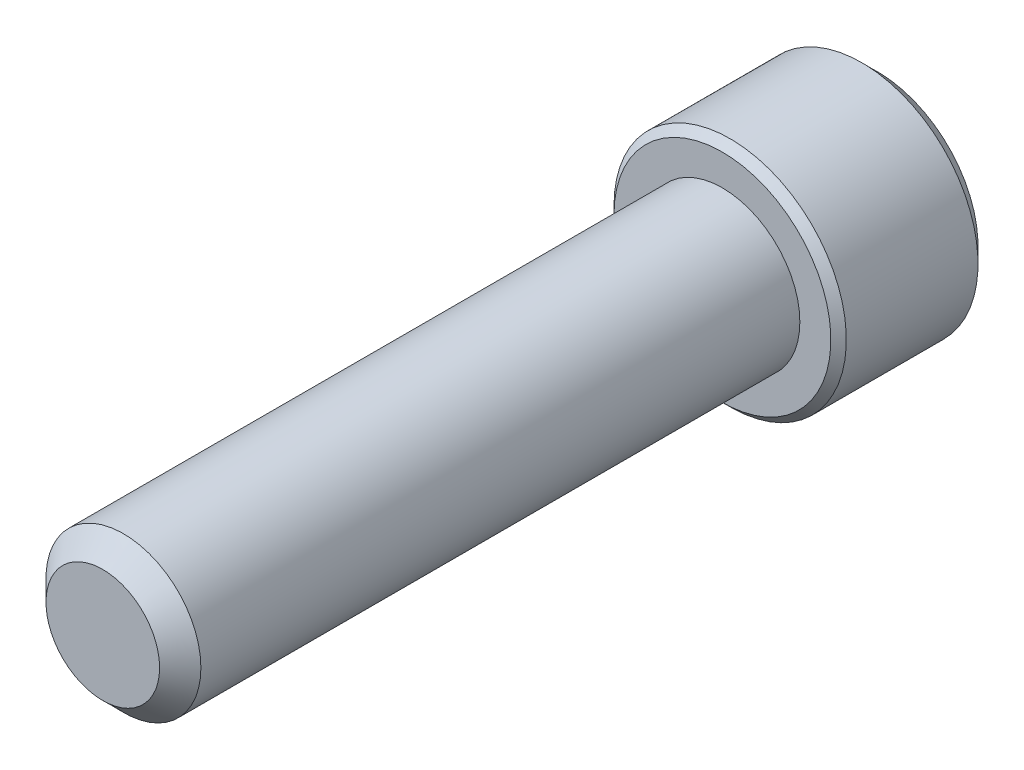
ISO-10303-21;
HEADER;
FILE_DESCRIPTION(('STEP AP214'),'2;1');
FILE_NAME('part.step','',(''),(''),'','','');
FILE_SCHEMA(('AUTOMOTIVE_DESIGN { 1 0 10303 214 1 1 1 1 }'));
ENDSEC;
DATA;
#1=APPLICATION_CONTEXT('core data for automotive mechanical design processes');
#2=APPLICATION_PROTOCOL_DEFINITION('international standard','automotive_design',2000,#1);
#3=PRODUCT_CONTEXT('',#1,'mechanical');
#4=PRODUCT('Part','Part','',(#3));
#5=PRODUCT_RELATED_PRODUCT_CATEGORY('part','',(#4));
#6=PRODUCT_DEFINITION_FORMATION('','',#4);
#7=PRODUCT_DEFINITION_CONTEXT('part definition',#1,'design');
#8=PRODUCT_DEFINITION('design','',#6,#7);
#9=PRODUCT_DEFINITION_SHAPE('','',#8);
#10=(LENGTH_UNIT() NAMED_UNIT(*) SI_UNIT(.MILLI.,.METRE.));
#11=(NAMED_UNIT(*) PLANE_ANGLE_UNIT() SI_UNIT($,.RADIAN.));
#12=(NAMED_UNIT(*) SI_UNIT($,.STERADIAN.) SOLID_ANGLE_UNIT());
#13=UNCERTAINTY_MEASURE_WITH_UNIT(LENGTH_MEASURE(1.E-05),#10,'distance_accuracy_value','');
#14=(GEOMETRIC_REPRESENTATION_CONTEXT(3) GLOBAL_UNCERTAINTY_ASSIGNED_CONTEXT((#13)) GLOBAL_UNIT_ASSIGNED_CONTEXT((#10,
#11,#12)) REPRESENTATION_CONTEXT('',''));
#15=CARTESIAN_POINT('',(0.,0.,0.));
#16=DIRECTION('',(0.,0.,1.));
#17=DIRECTION('',(1.,0.,0.));
#18=AXIS2_PLACEMENT_3D('',#15,#16,#17);
#19=CARTESIAN_POINT('',(0.,0.,-31.75));
#20=DIRECTION('',(0.,0.,1.));
#21=DIRECTION('',(1.,0.,0.));
#22=AXIS2_PLACEMENT_3D('',#19,#20,#21);
#23=CYLINDRICAL_SURFACE('',#22,3.96875);
#24=CARTESIAN_POINT('',(0.,0.,-1.05833333333333));
#25=DIRECTION('',(0.,0.,1.));
#26=DIRECTION('',(1.,0.,0.));
#27=AXIS2_PLACEMENT_3D('',#24,#25,#26);
#28=CIRCLE('',#27,3.96875);
#29=CARTESIAN_POINT('',(3.96875,0.,-1.05833333333333));
#30=VERTEX_POINT('',#29);
#31=EDGE_CURVE('E11',#30,#30,#28,.F.);
#32=ORIENTED_EDGE('',*,*,#31,.T.);
#33=EDGE_LOOP('',(#32));
#34=FACE_BOUND('',#33,.T.);
#35=CARTESIAN_POINT('',(0.,0.,-31.75));
#36=DIRECTION('',(0.,0.,-1.));
#37=DIRECTION('',(-1.,0.,0.));
#38=AXIS2_PLACEMENT_3D('',#35,#36,#37);
#39=CIRCLE('',#38,3.96875);
#40=CARTESIAN_POINT('',(-3.96875,0.,-31.75));
#41=VERTEX_POINT('',#40);
#42=EDGE_CURVE('E106',#41,#41,#39,.F.);
#43=ORIENTED_EDGE('',*,*,#42,.T.);
#44=EDGE_LOOP('',(#43));
#45=FACE_BOUND('',#44,.T.);
#46=ADVANCED_FACE('F32',(#34,#45),#23,.T.);
#47=CARTESIAN_POINT('',(0.,0.,0.));
#48=DIRECTION('',(0.,0.,1.));
#49=DIRECTION('',(1.,0.,0.));
#50=AXIS2_PLACEMENT_3D('',#47,#48,#49);
#51=PLANE('',#50);
#52=CARTESIAN_POINT('',(0.,0.,0.));
#53=DIRECTION('',(0.,0.,1.));
#54=DIRECTION('',(1.,0.,0.));
#55=AXIS2_PLACEMENT_3D('',#52,#53,#54);
#56=CIRCLE('',#55,2.91041666666667);
#57=CARTESIAN_POINT('',(2.91041666666667,0.,0.));
#58=VERTEX_POINT('',#57);
#59=EDGE_CURVE('E40',#58,#58,#56,.T.);
#60=ORIENTED_EDGE('',*,*,#59,.T.);
#61=EDGE_LOOP('',(#60));
#62=FACE_BOUND('',#61,.T.);
#63=ADVANCED_FACE('F176',(#62),#51,.T.);
#64=CARTESIAN_POINT('',(0.,0.,-39.6875));
#65=DIRECTION('',(0.,0.,1.));
#66=DIRECTION('',(1.,0.,0.));
#67=AXIS2_PLACEMENT_3D('',#64,#65,#66);
#68=CYLINDRICAL_SURFACE('',#67,5.953125);
#69=CARTESIAN_POINT('',(0.,0.,-32.146875));
#70=DIRECTION('',(0.,0.,-1.));
#71=DIRECTION('',(-1.,0.,0.));
#72=AXIS2_PLACEMENT_3D('',#69,#70,#71);
#73=CIRCLE('',#72,5.953125);
#74=CARTESIAN_POINT('',(-5.953125,0.,-32.146875));
#75=VERTEX_POINT('',#74);
#76=EDGE_CURVE('E168',#75,#75,#73,.T.);
#77=ORIENTED_EDGE('',*,*,#76,.T.);
#78=EDGE_LOOP('',(#77));
#79=FACE_BOUND('',#78,.T.);
#80=CARTESIAN_POINT('',(0.,0.,-38.89375));
#81=DIRECTION('',(0.,0.,-1.));
#82=DIRECTION('',(-1.,0.,0.));
#83=AXIS2_PLACEMENT_3D('',#80,#81,#82);
#84=CIRCLE('',#83,5.953125);
#85=CARTESIAN_POINT('',(-5.953125,0.,-38.89375));
#86=VERTEX_POINT('',#85);
#87=EDGE_CURVE('E165',#86,#86,#84,.F.);
#88=ORIENTED_EDGE('',*,*,#87,.T.);
#89=EDGE_LOOP('',(#88));
#90=FACE_BOUND('',#89,.T.);
#91=ADVANCED_FACE('F193',(#79,#90),#68,.T.);
#92=CARTESIAN_POINT('',(0.,0.,-39.6875));
#93=DIRECTION('',(0.,0.,-1.));
#94=DIRECTION('',(-1.,0.,0.));
#95=AXIS2_PLACEMENT_3D('',#92,#93,#94);
#96=PLANE('',#95);
#97=CARTESIAN_POINT('',(0.,0.,-39.6875));
#98=DIRECTION('',(0.,0.,-1.));
#99=DIRECTION('',(-1.,0.,0.));
#100=AXIS2_PLACEMENT_3D('',#97,#98,#99);
#101=CIRCLE('',#100,5.159375);
#102=CARTESIAN_POINT('',(-5.159375,0.,-39.6875));
#103=VERTEX_POINT('',#102);
#104=EDGE_CURVE('E105',#103,#103,#101,.T.);
#105=ORIENTED_EDGE('',*,*,#104,.T.);
#106=EDGE_LOOP('',(#105));
#107=FACE_BOUND('',#106,.T.);
#108=CARTESIAN_POINT('',(0.,0.,-39.6875));
#109=DIRECTION('',(0.,0.,-1.));
#110=DIRECTION('',(-1.,0.,0.));
#111=AXIS2_PLACEMENT_3D('',#108,#109,#110);
#112=CIRCLE('',#111,3.66617420935412);
#113=CARTESIAN_POINT('',(-3.175,1.83308710467706,-39.6875));
#114=VERTEX_POINT('',#113);
#115=CARTESIAN_POINT('',(0.,3.66617420935412,-39.6875));
#116=VERTEX_POINT('',#115);
#117=EDGE_CURVE('E86',#114,#116,#112,.T.);
#118=ORIENTED_EDGE('',*,*,#117,.F.);
#119=CARTESIAN_POINT('',(-3.175,-1.83308710467706,-39.6875));
#120=VERTEX_POINT('',#119);
#121=EDGE_CURVE('E46',#120,#114,#112,.T.);
#122=ORIENTED_EDGE('',*,*,#121,.F.);
#123=CARTESIAN_POINT('',(0.,-3.66617420935412,-39.6875));
#124=VERTEX_POINT('',#123);
#125=EDGE_CURVE('E400',#124,#120,#112,.T.);
#126=ORIENTED_EDGE('',*,*,#125,.F.);
#127=CARTESIAN_POINT('',(3.175,-1.83308710467706,-39.6875));
#128=VERTEX_POINT('',#127);
#129=EDGE_CURVE('E53',#128,#124,#112,.T.);
#130=ORIENTED_EDGE('',*,*,#129,.F.);
#131=CARTESIAN_POINT('',(3.175,1.83308710467706,-39.6875));
#132=VERTEX_POINT('',#131);
#133=EDGE_CURVE('E127',#132,#128,#112,.T.);
#134=ORIENTED_EDGE('',*,*,#133,.F.);
#135=EDGE_CURVE('E95',#116,#132,#112,.T.);
#136=ORIENTED_EDGE('',*,*,#135,.F.);
#137=EDGE_LOOP('',(#118,#122,#126,#130,#134,#136));
#138=FACE_BOUND('',#137,.T.);
#139=ADVANCED_FACE('F126',(#107,#138),#96,.T.);
#140=CARTESIAN_POINT('',(0.,0.,-31.75));
#141=DIRECTION('',(0.,0.,-1.));
#142=DIRECTION('',(-1.,0.,0.));
#143=AXIS2_PLACEMENT_3D('',#140,#141,#142);
#144=PLANE('',#143);
#145=CARTESIAN_POINT('',(0.,0.,-31.75));
#146=DIRECTION('',(0.,0.,-1.));
#147=DIRECTION('',(-1.,0.,0.));
#148=AXIS2_PLACEMENT_3D('',#145,#146,#147);
#149=CIRCLE('',#148,5.55625);
#150=CARTESIAN_POINT('',(-5.55625,0.,-31.75));
#151=VERTEX_POINT('',#150);
#152=EDGE_CURVE('E171',#151,#151,#149,.F.);
#153=ORIENTED_EDGE('',*,*,#152,.T.);
#154=EDGE_LOOP('',(#153));
#155=FACE_BOUND('',#154,.T.);
#156=ORIENTED_EDGE('',*,*,#42,.F.);
#157=EDGE_LOOP('',(#156));
#158=FACE_BOUND('',#157,.T.);
#159=ADVANCED_FACE('F209',(#155,#158),#144,.F.);
#160=CARTESIAN_POINT('',(0.,0.,-39.6875));
#161=DIRECTION('',(0.,0.,-1.));
#162=DIRECTION('',(-1.,0.,0.));
#163=AXIS2_PLACEMENT_3D('',#160,#161,#162);
#164=CONICAL_SURFACE('',#163,3.66617420935412,0.78539816339745);
#165=ORIENTED_EDGE('',*,*,#135,.T.);
#166=CARTESIAN_POINT('',(-0.00020000000000059,3.66628967940796,-39.6876154755089));
#167=CARTESIAN_POINT('',(0.108938349949826,3.60327862368552,-39.6246589836918));
#168=CARTESIAN_POINT('',(0.219901628077945,3.53921394518808,-39.5654001042347));
#169=CARTESIAN_POINT('',(0.446167846345947,3.40857908316254,-39.4568986557306));
#170=CARTESIAN_POINT('',(0.561492303252263,3.34199647692353,-39.4077164539387));
#171=CARTESIAN_POINT('',(0.794038522480626,3.207735854653,-39.323466458874));
#172=CARTESIAN_POINT('',(0.911201066281151,3.14009202845083,-39.2881869144994));
#173=CARTESIAN_POINT('',(1.14810544464628,3.00331522182952,-39.2338315701348));
#174=CARTESIAN_POINT('',(1.26784004264355,2.93418641944448,-39.2147151975296));
#175=CARTESIAN_POINT('',(1.47419791875158,2.81504564412411,-39.1974671306232));
#176=CARTESIAN_POINT('',(1.56055470772916,2.76518752876156,-39.1949139336138));
#177=CARTESIAN_POINT('',(1.73312781652472,2.66555239794355,-39.1992162731233));
#178=CARTESIAN_POINT('',(1.8193440764928,2.61577541704245,-39.2060751080214));
#179=CARTESIAN_POINT('',(1.99095979158713,2.51669303773557,-39.2288098833037));
#180=CARTESIAN_POINT('',(2.07635822425327,2.4673882296474,-39.2446959096873));
#181=CARTESIAN_POINT('',(2.24568840330547,2.36962540518969,-39.284617983998));
#182=CARTESIAN_POINT('',(2.32962026161975,2.32116732419836,-39.3086534070852));
#183=CARTESIAN_POINT('',(2.47862357928412,2.23514021863468,-39.3581052344172));
#184=CARTESIAN_POINT('',(2.54402485119173,2.19738077669348,-39.382221719301));
#185=CARTESIAN_POINT('',(2.67365325020511,2.12253978562849,-39.4343414671372));
#186=CARTESIAN_POINT('',(2.73788034144173,2.08545825721376,-39.4623448486035));
#187=CARTESIAN_POINT('',(2.8649580345126,2.01208991691129,-39.5216105655445));
#188=CARTESIAN_POINT('',(2.92781225074873,1.97580101824766,-39.5528626533542));
#189=CARTESIAN_POINT('',(3.0523566208481,1.90389529264474,-39.6182153443919));
#190=CARTESIAN_POINT('',(3.11404746097871,1.86827806948879,-39.6523141995185));
#191=CARTESIAN_POINT('',(3.1752,1.83297163462322,-39.6876154755089));
#192=B_SPLINE_CURVE_WITH_KNOTS('',3,(#166,#167,#168,#169,#170,#171,#172,#173,#174,#175,#176,
#177,#178,#179,#180,#181,#182,#183,#184,#185,#186,#187,#188,#189,#190,#191),.UNSPECIFIED.,.F.,
.F.,(4,2,2,2,2,2,2,2,2,2,2,2,4),(0.,0.422910572436809,0.84828505542781,1.26690402276128,
1.68446903107506,1.98329272958352,2.2822211754689,2.58148426995466,2.88072442418452,
3.11844134429546,3.35616551414405,3.59316134346767,3.8300126974443),.UNSPECIFIED.);
#193=EDGE_CURVE('E100',#116,#132,#192,.T.);
#194=ORIENTED_EDGE('',*,*,#193,.F.);
#195=EDGE_LOOP('',(#165,#194));
#196=FACE_BOUND('',#195,.T.);
#197=ADVANCED_FACE('F101',(#196),#164,.F.);
#198=ORIENTED_EDGE('',*,*,#133,.T.);
#199=CARTESIAN_POINT('',(3.175,-3.70444383584785,-40.9002118451619));
#200=CARTESIAN_POINT('',(3.175,-3.61446006856654,-40.8319043948676));
#201=CARTESIAN_POINT('',(3.175,-3.52397795214463,-40.7642428612445));
#202=CARTESIAN_POINT('',(3.175,-3.34181836123848,-40.6305025492024));
#203=CARTESIAN_POINT('',(3.175,-3.250140597284,-40.5644241654826));
#204=CARTESIAN_POINT('',(3.175,-3.06472035593928,-40.4336709408018));
#205=CARTESIAN_POINT('',(3.175,-2.97096738900307,-40.3690109250879));
#206=CARTESIAN_POINT('',(3.175,-2.78187869931256,-40.2420558022517));
#207=CARTESIAN_POINT('',(3.175,-2.68654308817008,-40.179760529372));
#208=CARTESIAN_POINT('',(3.175,-2.48836016870252,-40.0544784446062));
#209=CARTESIAN_POINT('',(3.175,-2.38540128536647,-39.9916672392123));
#210=CARTESIAN_POINT('',(3.175,-2.17707529026741,-39.8701078544743));
#211=CARTESIAN_POINT('',(3.175,-2.07170779370641,-39.811360330462));
#212=CARTESIAN_POINT('',(3.175,-1.85856318748113,-39.6991912176541));
#213=CARTESIAN_POINT('',(3.175,-1.75079438294671,-39.6457539709328));
#214=CARTESIAN_POINT('',(3.175,-1.53228582600746,-39.5454020450525));
#215=CARTESIAN_POINT('',(3.175,-1.42154746336339,-39.4984843761431));
#216=CARTESIAN_POINT('',(3.175,-1.20656057350991,-39.416530034464));
#217=CARTESIAN_POINT('',(3.175,-1.10257181507285,-39.3808189415949));
#218=CARTESIAN_POINT('',(3.175,-0.892048260878869,-39.3177329725217));
#219=CARTESIAN_POINT('',(3.175,-0.785513294311063,-39.2903586572879));
#220=CARTESIAN_POINT('',(3.175,-0.572329012717394,-39.2458460023287));
#221=CARTESIAN_POINT('',(3.175,-0.465717564636556,-39.2285292889146));
#222=CARTESIAN_POINT('',(3.175,-0.251301383583122,-39.2044756602937));
#223=CARTESIAN_POINT('',(3.175,-0.143496870917772,-39.1977368235873));
#224=CARTESIAN_POINT('',(3.175,0.068106995182755,-39.1953609564692));
#225=CARTESIAN_POINT('',(3.175,0.171901813638644,-39.1993091223896));
#226=CARTESIAN_POINT('',(3.175,0.378625872879028,-39.2171624071181));
#227=CARTESIAN_POINT('',(3.175,0.48155503009556,-39.2310684763143));
#228=CARTESIAN_POINT('',(3.175,0.687543944903109,-39.2683074222191));
#229=CARTESIAN_POINT('',(3.175,0.790573911747975,-39.2918024293294));
#230=CARTESIAN_POINT('',(3.175,0.994382635323689,-39.3469517792586));
#231=CARTESIAN_POINT('',(3.175,1.09516156281328,-39.3786055008759));
#232=CARTESIAN_POINT('',(3.175,1.30251417649916,-39.4516294931737));
#233=CARTESIAN_POINT('',(3.175,1.40887912364162,-39.4935863005657));
#234=CARTESIAN_POINT('',(3.175,1.61884111284847,-39.5839490627203));
#235=CARTESIAN_POINT('',(3.175,1.72243722600422,-39.6323571499939));
#236=CARTESIAN_POINT('',(3.175,1.92738358083041,-39.7344798355874));
#237=CARTESIAN_POINT('',(3.175,2.02872533588119,-39.788211328075));
#238=CARTESIAN_POINT('',(3.175,2.22907994672305,-39.8997921629552));
#239=CARTESIAN_POINT('',(3.175,2.32809316592036,-39.9576408570403));
#240=CARTESIAN_POINT('',(3.175,2.51923503723041,-40.0736949409625));
#241=CARTESIAN_POINT('',(3.175,2.61146147877823,-40.1317401210939));
#242=CARTESIAN_POINT('',(3.175,2.79433061473592,-40.250281230002));
#243=CARTESIAN_POINT('',(3.175,2.88497318880335,-40.310777343852));
#244=CARTESIAN_POINT('',(3.175,3.06414875022216,-40.4332851399095));
#245=CARTESIAN_POINT('',(3.175,3.15269287411231,-40.4952805926272));
#246=CARTESIAN_POINT('',(3.175,3.32856950185137,-40.6209183631728));
#247=CARTESIAN_POINT('',(3.175,3.41590233249717,-40.6845602229942));
#248=CARTESIAN_POINT('',(3.175,3.50272764399218,-40.7488754675913));
#249=B_SPLINE_CURVE_WITH_KNOTS('',3,(#199,#200,#201,#202,#203,#204,#205,#206,#207,#208,#209,
#210,#211,#212,#213,#214,#215,#216,#217,#218,#219,#220,#221,#222,#223,#224,#225,#226,#227,#228,
#229,#230,#231,#232,#233,#234,#235,#236,#237,#238,#239,#240,#241,#242,#243,#244,#245,#246,#247,
#248),.UNSPECIFIED.,.F.,.F.,(4,2,2,2,2,2,2,2,2,2,2,2,2,2,2,2,2,2,2,2,2,2,2,2,4),(0.,
0.338926722917917,0.677937083279515,1.01957183491539,1.36118259515686,1.72292567400708,
2.08472695420016,2.44542763005297,2.8059623458982,3.13552343983682,3.46510670458908,
3.78865064563719,4.11213580725537,4.42324708341662,4.73438805617943,5.05102342839298,
5.36763469922674,5.71039210015347,6.05326308403164,6.39725934486602,6.74120155829904,
7.06807292474688,7.39496901986435,7.71921932182542,8.0433803719942),.UNSPECIFIED.);
#250=EDGE_CURVE('E94',#132,#128,#249,.F.);
#251=ORIENTED_EDGE('',*,*,#250,.F.);
#252=EDGE_LOOP('',(#198,#251));
#253=FACE_BOUND('',#252,.T.);
#254=ADVANCED_FACE('F275',(#253),#164,.F.);
#255=ORIENTED_EDGE('',*,*,#129,.T.);
#256=CARTESIAN_POINT('',(3.1752,-1.83297163462322,-39.6876154755089));
#257=CARTESIAN_POINT('',(3.06606165005017,-1.89598269034567,-39.6246589836918));
#258=CARTESIAN_POINT('',(2.95509837192205,-1.9600473688431,-39.5654001042347));
#259=CARTESIAN_POINT('',(2.72883215365405,-2.09068223086865,-39.4568986557306));
#260=CARTESIAN_POINT('',(2.61350769674774,-2.15726483710766,-39.4077164539387));
#261=CARTESIAN_POINT('',(2.38096147751937,-2.29152545937819,-39.323466458874));
#262=CARTESIAN_POINT('',(2.26379893371885,-2.35916928558036,-39.2881869144995));
#263=CARTESIAN_POINT('',(2.02689455535372,-2.49594609220167,-39.2338315701348));
#264=CARTESIAN_POINT('',(1.90715995735645,-2.56507489458671,-39.2147151975296));
#265=CARTESIAN_POINT('',(1.70080208124842,-2.68421566990707,-39.1974671306232));
#266=CARTESIAN_POINT('',(1.61444529227084,-2.73407378526963,-39.1949139336138));
#267=CARTESIAN_POINT('',(1.44187218347528,-2.83370891608764,-39.1992162731233));
#268=CARTESIAN_POINT('',(1.3556559235072,-2.88348589698873,-39.2060751080214));
#269=CARTESIAN_POINT('',(1.18404020841287,-2.98256827629561,-39.2288098833037));
#270=CARTESIAN_POINT('',(1.09864177574673,-3.03187308438378,-39.2446959096873));
#271=CARTESIAN_POINT('',(0.929311596694525,-3.1296359088415,-39.284617983998));
#272=CARTESIAN_POINT('',(0.845379738380251,-3.17809398983283,-39.3086534070852));
#273=CARTESIAN_POINT('',(0.696376420715883,-3.2641210953965,-39.3581052344172));
#274=CARTESIAN_POINT('',(0.630975148808266,-3.30188053733771,-39.382221719301));
#275=CARTESIAN_POINT('',(0.50134674979489,-3.3767215284027,-39.4343414671372));
#276=CARTESIAN_POINT('',(0.437119658558273,-3.41380305681743,-39.4623448486035));
#277=CARTESIAN_POINT('',(0.310041965487397,-3.4871713971199,-39.5216105655445));
#278=CARTESIAN_POINT('',(0.247187749251273,-3.52346029578352,-39.5528626533542));
#279=CARTESIAN_POINT('',(0.122643379151905,-3.59536602138645,-39.6182153443919));
#280=CARTESIAN_POINT('',(0.0609525390212888,-3.63098324454239,-39.6523141995185));
#281=CARTESIAN_POINT('',(-0.000200000000002001,-3.66628967940796,-39.6876154755089));
#282=B_SPLINE_CURVE_WITH_KNOTS('',3,(#256,#257,#258,#259,#260,#261,#262,#263,#264,#265,#266,
#267,#268,#269,#270,#271,#272,#273,#274,#275,#276,#277,#278,#279,#280,#281),.UNSPECIFIED.,.F.,
.F.,(4,2,2,2,2,2,2,2,2,2,2,2,4),(0.,0.422910572436809,0.84828505542781,1.26690402276127,
1.68446903107506,1.98329272958352,2.2822211754689,2.58148426995466,2.88072442418452,
3.11844134429546,3.35616551414405,3.59316134346767,3.8300126974443),.UNSPECIFIED.);
#283=EDGE_CURVE('E136',#128,#124,#282,.T.);
#284=ORIENTED_EDGE('',*,*,#283,.F.);
#285=EDGE_LOOP('',(#255,#284));
#286=FACE_BOUND('',#285,.T.);
#287=ADVANCED_FACE('F267',(#286),#164,.F.);
#288=ORIENTED_EDGE('',*,*,#125,.T.);
#289=CARTESIAN_POINT('',(0.000200000000001088,-3.66628967940796,-39.6876154755089));
#290=CARTESIAN_POINT('',(-0.108938349949826,-3.60327862368552,-39.6246589836918));
#291=CARTESIAN_POINT('',(-0.219901628077945,-3.53921394518809,-39.5654001042347));
#292=CARTESIAN_POINT('',(-0.446167846345946,-3.40857908316254,-39.4568986557306));
#293=CARTESIAN_POINT('',(-0.561492303252263,-3.34199647692353,-39.4077164539387));
#294=CARTESIAN_POINT('',(-0.794038522480626,-3.207735854653,-39.323466458874));
#295=CARTESIAN_POINT('',(-0.911201066281151,-3.14009202845083,-39.2881869144994));
#296=CARTESIAN_POINT('',(-1.14810544464628,-3.00331522182952,-39.2338315701348));
#297=CARTESIAN_POINT('',(-1.26784004264355,-2.93418641944448,-39.2147151975296));
#298=CARTESIAN_POINT('',(-1.47419791875158,-2.81504564412411,-39.1974671306232));
#299=CARTESIAN_POINT('',(-1.56055470772915,-2.76518752876156,-39.1949139336138));
#300=CARTESIAN_POINT('',(-1.73312781652472,-2.66555239794355,-39.1992162731233));
#301=CARTESIAN_POINT('',(-1.8193440764928,-2.61577541704245,-39.2060751080214));
#302=CARTESIAN_POINT('',(-1.99095979158713,-2.51669303773557,-39.2288098833037));
#303=CARTESIAN_POINT('',(-2.07635822425327,-2.4673882296474,-39.2446959096873));
#304=CARTESIAN_POINT('',(-2.24568840330547,-2.36962540518969,-39.284617983998));
#305=CARTESIAN_POINT('',(-2.32962026161975,-2.32116732419836,-39.3086534070852));
#306=CARTESIAN_POINT('',(-2.47862357928412,-2.23514021863469,-39.3581052344172));
#307=CARTESIAN_POINT('',(-2.54402485119173,-2.19738077669348,-39.382221719301));
#308=CARTESIAN_POINT('',(-2.67365325020511,-2.12253978562849,-39.4343414671372));
#309=CARTESIAN_POINT('',(-2.73788034144173,-2.08545825721376,-39.4623448486035));
#310=CARTESIAN_POINT('',(-2.8649580345126,-2.01208991691129,-39.5216105655445));
#311=CARTESIAN_POINT('',(-2.92781225074873,-1.97580101824766,-39.5528626533542));
#312=CARTESIAN_POINT('',(-3.0523566208481,-1.90389529264474,-39.6182153443919));
#313=CARTESIAN_POINT('',(-3.11404746097871,-1.86827806948879,-39.6523141995185));
#314=CARTESIAN_POINT('',(-3.1752,-1.83297163462322,-39.6876154755089));
#315=B_SPLINE_CURVE_WITH_KNOTS('',3,(#289,#290,#291,#292,#293,#294,#295,#296,#297,#298,#299,
#300,#301,#302,#303,#304,#305,#306,#307,#308,#309,#310,#311,#312,#313,#314),.UNSPECIFIED.,.F.,
.F.,(4,2,2,2,2,2,2,2,2,2,2,2,4),(0.,0.422910572436809,0.848285055427809,1.26690402276128,
1.68446903107506,1.98329272958352,2.2822211754689,2.58148426995466,2.88072442418452,
3.11844134429546,3.35616551414405,3.59316134346767,3.8300126974443),.UNSPECIFIED.);
#316=EDGE_CURVE('E363',#124,#120,#315,.T.);
#317=ORIENTED_EDGE('',*,*,#316,.F.);
#318=EDGE_LOOP('',(#288,#317));
#319=FACE_BOUND('',#318,.T.);
#320=ADVANCED_FACE('F260',(#319),#164,.F.);
#321=ORIENTED_EDGE('',*,*,#121,.T.);
#322=CARTESIAN_POINT('',(-3.175,-3.70444383603083,-40.9002118453009));
#323=CARTESIAN_POINT('',(-3.175,-3.61446006874434,-40.8319043950011));
#324=CARTESIAN_POINT('',(-3.175,-3.52397795231723,-40.7642428613727));
#325=CARTESIAN_POINT('',(-3.175,-3.34181836140064,-40.63050254932));
#326=CARTESIAN_POINT('',(-3.175,-3.25014059744092,-40.5644241655949));
#327=CARTESIAN_POINT('',(-3.175,-3.06472035608553,-40.4336709409034));
#328=CARTESIAN_POINT('',(-3.175,-2.9709673891439,-40.3690109251841));
#329=CARTESIAN_POINT('',(-3.175,-2.78187869944244,-40.2420558023373));
#330=CARTESIAN_POINT('',(-3.175,-2.68654308829444,-40.1797605294523));
#331=CARTESIAN_POINT('',(-3.175,-2.48836016881498,-40.0544784446755));
#332=CARTESIAN_POINT('',(-3.175,-2.38540128547252,-39.991667239276));
#333=CARTESIAN_POINT('',(-3.175,-2.17707529036043,-39.8701078545269));
#334=CARTESIAN_POINT('',(-3.175,-2.0717077937928,-39.8113603305091));
#335=CARTESIAN_POINT('',(-3.175,-1.85856318755401,-39.6991912176908));
#336=CARTESIAN_POINT('',(-3.175,-1.75079438301272,-39.6457539709646));
#337=CARTESIAN_POINT('',(-3.175,-1.53228582605937,-39.5454020450749));
#338=CARTESIAN_POINT('',(-3.175,-1.42154746340806,-39.4984843761612));
#339=CARTESIAN_POINT('',(-3.175,-1.20656057355148,-39.416530034479));
#340=CARTESIAN_POINT('',(-3.175,-1.10257181511889,-39.3808189416102));
#341=CARTESIAN_POINT('',(-3.175,-0.892048260933982,-39.3177329725367));
#342=CARTESIAN_POINT('',(-3.175,-0.785513294370794,-39.2903586573024));
#343=CARTESIAN_POINT('',(-3.175,-0.572329012786208,-39.2458460023411));
#344=CARTESIAN_POINT('',(-3.175,-0.465717564709834,-39.2285292889253));
#345=CARTESIAN_POINT('',(-3.175,-0.251301383665186,-39.2044756603003));
#346=CARTESIAN_POINT('',(-3.175,-0.14349687100416,-39.1977368235913));
#347=CARTESIAN_POINT('',(-3.175,0.0681069950885746,-39.1953609564673));
#348=CARTESIAN_POINT('',(-3.175,0.171901813540983,-39.1993091223845));
#349=CARTESIAN_POINT('',(-3.175,0.378625872774766,-39.2171624071059));
#350=CARTESIAN_POINT('',(-3.175,0.481555029988177,-39.2310684762983));
#351=CARTESIAN_POINT('',(-3.175,0.687543944789565,-39.2683074221952));
#352=CARTESIAN_POINT('',(-3.175,0.790573911631401,-39.2918024293013));
#353=CARTESIAN_POINT('',(-3.175,0.994382635201356,-39.346951779222));
#354=CARTESIAN_POINT('',(-3.175,1.09516156268822,-39.3786055008352));
#355=CARTESIAN_POINT('',(-3.175,1.30251417635927,-39.4516294931208));
#356=CARTESIAN_POINT('',(-3.175,1.40887912348989,-39.4935863005044));
#357=CARTESIAN_POINT('',(-3.175,1.61884111267367,-39.5839490626411));
#358=CARTESIAN_POINT('',(-3.175,1.72243722581818,-39.6323571499053));
#359=CARTESIAN_POINT('',(-3.175,1.92738358062232,-39.7344798354796));
#360=CARTESIAN_POINT('',(-3.175,2.02872533566228,-39.7882113279573));
#361=CARTESIAN_POINT('',(-3.175,2.22907994648283,-39.8997921628173));
#362=CARTESIAN_POINT('',(-3.175,2.32809316566967,-39.9576408568921));
#363=CARTESIAN_POINT('',(-3.175,2.51923503696069,-40.0736949407949));
#364=CARTESIAN_POINT('',(-3.175,2.61146147849992,-40.1317401209172));
#365=CARTESIAN_POINT('',(-3.175,2.79433061444055,-40.2502812298069));
#366=CARTESIAN_POINT('',(-3.175,2.88497318849951,-40.3107773436477));
#367=CARTESIAN_POINT('',(-3.175,3.06414874990159,-40.4332851396869));
#368=CARTESIAN_POINT('',(-3.175,3.15269287378347,-40.4952805923955));
#369=CARTESIAN_POINT('',(-3.175,3.32856950150606,-40.6209183629229));
#370=CARTESIAN_POINT('',(-3.175,3.41590233214365,-40.6845602227352));
#371=CARTESIAN_POINT('',(-3.175,3.50272764363046,-40.7488754673233));
#372=B_SPLINE_CURVE_WITH_KNOTS('',3,(#322,#323,#324,#325,#326,#327,#328,#329,#330,#331,#332,
#333,#334,#335,#336,#337,#338,#339,#340,#341,#342,#343,#344,#345,#346,#347,#348,#349,#350,#351,
#352,#353,#354,#355,#356,#357,#358,#359,#360,#361,#362,#363,#364,#365,#366,#367,#368,#369,#370,
#371),.UNSPECIFIED.,.F.,.F.,(4,2,2,2,2,2,2,2,2,2,2,2,2,2,2,2,2,2,2,2,2,2,2,2,4),(0.,
0.338926722940014,0.677937083323707,1.0195718349821,1.36118259524609,1.72292567412157,
2.08472695433995,2.44542763021783,2.8059623460881,3.13552344001376,3.46510670475308,
3.7886506457888,4.1121358073946,4.42324708354509,4.73438805629712,5.05102342849904,
5.36763469932117,5.71039210020556,6.05326308404133,6.39725934483308,6.74120155822348,
7.06807292463488,7.3949690197159,7.71921932164102,8.04338037177384),.UNSPECIFIED.);
#373=EDGE_CURVE('E116',#120,#114,#372,.T.);
#374=ORIENTED_EDGE('',*,*,#373,.F.);
#375=EDGE_LOOP('',(#321,#374));
#376=FACE_BOUND('',#375,.T.);
#377=ADVANCED_FACE('F252',(#376),#164,.F.);
#378=ORIENTED_EDGE('',*,*,#117,.T.);
#379=CARTESIAN_POINT('',(-3.1752,1.83297163462322,-39.6876154755089));
#380=CARTESIAN_POINT('',(-3.06606165005017,1.89598269034567,-39.6246589836918));
#381=CARTESIAN_POINT('',(-2.95509837192205,1.9600473688431,-39.5654001042347));
#382=CARTESIAN_POINT('',(-2.72883215365405,2.09068223086865,-39.4568986557306));
#383=CARTESIAN_POINT('',(-2.61350769674774,2.15726483710766,-39.4077164539387));
#384=CARTESIAN_POINT('',(-2.38096147751937,2.29152545937818,-39.323466458874));
#385=CARTESIAN_POINT('',(-2.26379893371885,2.35916928558036,-39.2881869144994));
#386=CARTESIAN_POINT('',(-2.02689455535372,2.49594609220167,-39.2338315701348));
#387=CARTESIAN_POINT('',(-1.90715995735644,2.5650748945867,-39.2147151975296));
#388=CARTESIAN_POINT('',(-1.70080208124842,2.68421566990707,-39.1974671306232));
#389=CARTESIAN_POINT('',(-1.61444529227084,2.73407378526963,-39.1949139336138));
#390=CARTESIAN_POINT('',(-1.44187218347528,2.83370891608764,-39.1992162731233));
#391=CARTESIAN_POINT('',(-1.35565592350719,2.88348589698873,-39.2060751080214));
#392=CARTESIAN_POINT('',(-1.18404020841287,2.98256827629561,-39.2288098833037));
#393=CARTESIAN_POINT('',(-1.09864177574672,3.03187308438378,-39.2446959096873));
#394=CARTESIAN_POINT('',(-0.929311596694523,3.1296359088415,-39.284617983998));
#395=CARTESIAN_POINT('',(-0.845379738380249,3.17809398983283,-39.3086534070852));
#396=CARTESIAN_POINT('',(-0.696376420715881,3.2641210953965,-39.3581052344172));
#397=CARTESIAN_POINT('',(-0.630975148808264,3.30188053733771,-39.382221719301));
#398=CARTESIAN_POINT('',(-0.501346749794889,3.3767215284027,-39.4343414671372));
#399=CARTESIAN_POINT('',(-0.437119658558272,3.41380305681743,-39.4623448486035));
#400=CARTESIAN_POINT('',(-0.310041965487396,3.48717139711989,-39.5216105655445));
#401=CARTESIAN_POINT('',(-0.247187749251273,3.52346029578352,-39.5528626533542));
#402=CARTESIAN_POINT('',(-0.122643379151905,3.59536602138644,-39.6182153443919));
#403=CARTESIAN_POINT('',(-0.0609525390212894,3.63098324454239,-39.6523141995185));
#404=CARTESIAN_POINT('',(0.000200000000000794,3.66628967940796,-39.6876154755089));
#405=B_SPLINE_CURVE_WITH_KNOTS('',3,(#379,#380,#381,#382,#383,#384,#385,#386,#387,#388,#389,
#390,#391,#392,#393,#394,#395,#396,#397,#398,#399,#400,#401,#402,#403,#404),.UNSPECIFIED.,.F.,
.F.,(4,2,2,2,2,2,2,2,2,2,2,2,4),(0.,0.422910572436809,0.84828505542781,1.26690402276128,
1.68446903107507,1.98329272958352,2.28222117546891,2.58148426995466,2.88072442418452,
3.11844134429547,3.35616551414405,3.59316134346767,3.8300126974443),.UNSPECIFIED.);
#406=EDGE_CURVE('E90',#114,#116,#405,.T.);
#407=ORIENTED_EDGE('',*,*,#406,.F.);
#408=EDGE_LOOP('',(#378,#407));
#409=FACE_BOUND('',#408,.T.);
#410=ADVANCED_FACE('F88',(#409),#164,.F.);
#411=CARTESIAN_POINT('',(3.175,5.49926131403118,-34.925));
#412=DIRECTION('',(0.,0.,-1.));
#413=DIRECTION('',(-1.,0.,0.));
#414=AXIS2_PLACEMENT_3D('',#411,#412,#413);
#415=PLANE('',#414);
#416=DIRECTION('',(0.866025403784439,0.5,0.));
#417=VECTOR('',#416,1.);
#418=CARTESIAN_POINT('',(-3.175,1.83308710467706,-34.925));
#419=LINE('',#418,#417);
#420=CARTESIAN_POINT('',(-3.175,1.83308710467706,-34.925));
#421=VERTEX_POINT('',#420);
#422=CARTESIAN_POINT('',(0.,3.66617420935412,-34.925));
#423=VERTEX_POINT('',#422);
#424=EDGE_CURVE('E115',#421,#423,#419,.T.);
#425=ORIENTED_EDGE('',*,*,#424,.T.);
#426=DIRECTION('',(0.866025403784439,-0.5,0.));
#427=VECTOR('',#426,1.);
#428=CARTESIAN_POINT('',(0.,3.66617420935412,-34.925));
#429=LINE('',#428,#427);
#430=CARTESIAN_POINT('',(3.175,1.83308710467706,-34.925));
#431=VERTEX_POINT('',#430);
#432=EDGE_CURVE('E120',#423,#431,#429,.T.);
#433=ORIENTED_EDGE('',*,*,#432,.T.);
#434=DIRECTION('',(0.,-1.,0.));
#435=VECTOR('',#434,1.);
#436=CARTESIAN_POINT('',(3.175,1.83308710467706,-34.925));
#437=LINE('',#436,#435);
#438=CARTESIAN_POINT('',(3.175,-1.83308710467706,-34.925));
#439=VERTEX_POINT('',#438);
#440=EDGE_CURVE('E373',#431,#439,#437,.T.);
#441=ORIENTED_EDGE('',*,*,#440,.T.);
#442=DIRECTION('',(-0.866025403784439,-0.5,0.));
#443=VECTOR('',#442,1.);
#444=CARTESIAN_POINT('',(3.175,-1.83308710467706,-34.925));
#445=LINE('',#444,#443);
#446=CARTESIAN_POINT('',(0.,-3.66617420935412,-34.925));
#447=VERTEX_POINT('',#446);
#448=EDGE_CURVE('E376',#439,#447,#445,.T.);
#449=ORIENTED_EDGE('',*,*,#448,.T.);
#450=DIRECTION('',(-0.866025403784439,0.5,0.));
#451=VECTOR('',#450,1.);
#452=CARTESIAN_POINT('',(0.,-3.66617420935412,-34.925));
#453=LINE('',#452,#451);
#454=CARTESIAN_POINT('',(-3.175,-1.83308710467706,-34.925));
#455=VERTEX_POINT('',#454);
#456=EDGE_CURVE('E379',#447,#455,#453,.T.);
#457=ORIENTED_EDGE('',*,*,#456,.T.);
#458=DIRECTION('',(0.,1.,0.));
#459=VECTOR('',#458,1.);
#460=CARTESIAN_POINT('',(-3.175,-1.83308710467706,-34.925));
#461=LINE('',#460,#459);
#462=EDGE_CURVE('E123',#455,#421,#461,.T.);
#463=ORIENTED_EDGE('',*,*,#462,.T.);
#464=EDGE_LOOP('',(#425,#433,#441,#449,#457,#463));
#465=FACE_BOUND('',#464,.T.);
#466=ADVANCED_FACE('F155',(#465),#415,.T.);
#467=CARTESIAN_POINT('',(0.,3.66617420935412,-34.925));
#468=DIRECTION('',(0.5,0.866025403784439,0.));
#469=DIRECTION('',(-0.866025403784439,0.5,0.));
#470=AXIS2_PLACEMENT_3D('',#467,#468,#469);
#471=PLANE('',#470);
#472=DIRECTION('',(0.,0.,-1.));
#473=VECTOR('',#472,1.);
#474=CARTESIAN_POINT('',(0.,3.66617420935412,-34.925));
#475=LINE('',#474,#473);
#476=EDGE_CURVE('E112',#423,#116,#475,.T.);
#477=ORIENTED_EDGE('',*,*,#476,.T.);
#478=ORIENTED_EDGE('',*,*,#193,.T.);
#479=DIRECTION('',(0.,0.,-1.));
#480=VECTOR('',#479,1.);
#481=CARTESIAN_POINT('',(3.175,1.83308710467706,-34.925));
#482=LINE('',#481,#480);
#483=EDGE_CURVE('E122',#431,#132,#482,.T.);
#484=ORIENTED_EDGE('',*,*,#483,.F.);
#485=ORIENTED_EDGE('',*,*,#432,.F.);
#486=EDGE_LOOP('',(#477,#478,#484,#485));
#487=FACE_BOUND('',#486,.T.);
#488=ADVANCED_FACE('F118',(#487),#471,.F.);
#489=CARTESIAN_POINT('',(3.175,1.83308710467706,-34.925));
#490=DIRECTION('',(1.,0.,0.));
#491=DIRECTION('',(0.,1.,0.));
#492=AXIS2_PLACEMENT_3D('',#489,#490,#491);
#493=PLANE('',#492);
#494=ORIENTED_EDGE('',*,*,#483,.T.);
#495=ORIENTED_EDGE('',*,*,#250,.T.);
#496=DIRECTION('',(0.,0.,-1.));
#497=VECTOR('',#496,1.);
#498=CARTESIAN_POINT('',(3.175,-1.83308710467706,-34.925));
#499=LINE('',#498,#497);
#500=EDGE_CURVE('E390',#439,#128,#499,.T.);
#501=ORIENTED_EDGE('',*,*,#500,.F.);
#502=ORIENTED_EDGE('',*,*,#440,.F.);
#503=EDGE_LOOP('',(#494,#495,#501,#502));
#504=FACE_BOUND('',#503,.T.);
#505=ADVANCED_FACE('F144',(#504),#493,.F.);
#506=CARTESIAN_POINT('',(3.175,-1.83308710467706,-34.925));
#507=DIRECTION('',(0.5,-0.866025403784439,0.));
#508=DIRECTION('',(0.866025403784439,0.5,0.));
#509=AXIS2_PLACEMENT_3D('',#506,#507,#508);
#510=PLANE('',#509);
#511=ORIENTED_EDGE('',*,*,#500,.T.);
#512=ORIENTED_EDGE('',*,*,#283,.T.);
#513=DIRECTION('',(0.,0.,-1.));
#514=VECTOR('',#513,1.);
#515=CARTESIAN_POINT('',(0.,-3.66617420935412,-34.925));
#516=LINE('',#515,#514);
#517=EDGE_CURVE('E387',#447,#124,#516,.T.);
#518=ORIENTED_EDGE('',*,*,#517,.F.);
#519=ORIENTED_EDGE('',*,*,#448,.F.);
#520=EDGE_LOOP('',(#511,#512,#518,#519));
#521=FACE_BOUND('',#520,.T.);
#522=ADVANCED_FACE('F148',(#521),#510,.F.);
#523=CARTESIAN_POINT('',(0.,-3.66617420935412,-34.925));
#524=DIRECTION('',(-0.5,-0.866025403784439,0.));
#525=DIRECTION('',(0.866025403784439,-0.5,0.));
#526=AXIS2_PLACEMENT_3D('',#523,#524,#525);
#527=PLANE('',#526);
#528=ORIENTED_EDGE('',*,*,#517,.T.);
#529=ORIENTED_EDGE('',*,*,#316,.T.);
#530=DIRECTION('',(0.,0.,-1.));
#531=VECTOR('',#530,1.);
#532=CARTESIAN_POINT('',(-3.175,-1.83308710467706,-34.925));
#533=LINE('',#532,#531);
#534=EDGE_CURVE('E385',#455,#120,#533,.T.);
#535=ORIENTED_EDGE('',*,*,#534,.F.);
#536=ORIENTED_EDGE('',*,*,#456,.F.);
#537=EDGE_LOOP('',(#528,#529,#535,#536));
#538=FACE_BOUND('',#537,.T.);
#539=ADVANCED_FACE('F311',(#538),#527,.F.);
#540=CARTESIAN_POINT('',(-3.175,-1.83308710467706,-34.925));
#541=DIRECTION('',(-1.,0.,0.));
#542=DIRECTION('',(0.,-1.,0.));
#543=AXIS2_PLACEMENT_3D('',#540,#541,#542);
#544=PLANE('',#543);
#545=ORIENTED_EDGE('',*,*,#534,.T.);
#546=ORIENTED_EDGE('',*,*,#373,.T.);
#547=DIRECTION('',(0.,0.,-1.));
#548=VECTOR('',#547,1.);
#549=CARTESIAN_POINT('',(-3.175,1.83308710467706,-34.925));
#550=LINE('',#549,#548);
#551=EDGE_CURVE('E114',#421,#114,#550,.T.);
#552=ORIENTED_EDGE('',*,*,#551,.F.);
#553=ORIENTED_EDGE('',*,*,#462,.F.);
#554=EDGE_LOOP('',(#545,#546,#552,#553));
#555=FACE_BOUND('',#554,.T.);
#556=ADVANCED_FACE('F203',(#555),#544,.F.);
#557=CARTESIAN_POINT('',(-3.175,1.83308710467706,-34.925));
#558=DIRECTION('',(-0.5,0.866025403784439,0.));
#559=DIRECTION('',(-0.866025403784439,-0.5,0.));
#560=AXIS2_PLACEMENT_3D('',#557,#558,#559);
#561=PLANE('',#560);
#562=ORIENTED_EDGE('',*,*,#551,.T.);
#563=ORIENTED_EDGE('',*,*,#406,.T.);
#564=ORIENTED_EDGE('',*,*,#476,.F.);
#565=ORIENTED_EDGE('',*,*,#424,.F.);
#566=EDGE_LOOP('',(#562,#563,#564,#565));
#567=FACE_BOUND('',#566,.T.);
#568=ADVANCED_FACE('F110',(#567),#561,.F.);
#569=CARTESIAN_POINT('',(0.,0.,-39.6875));
#570=DIRECTION('',(0.,0.,1.));
#571=DIRECTION('',(1.,0.,0.));
#572=AXIS2_PLACEMENT_3D('',#569,#570,#571);
#573=CONICAL_SURFACE('',#572,5.159375,0.78539816339745);
#574=ORIENTED_EDGE('',*,*,#87,.F.);
#575=EDGE_LOOP('',(#574));
#576=FACE_BOUND('',#575,.T.);
#577=ORIENTED_EDGE('',*,*,#104,.F.);
#578=EDGE_LOOP('',(#577));
#579=FACE_BOUND('',#578,.T.);
#580=ADVANCED_FACE('F184',(#576,#579),#573,.T.);
#581=CARTESIAN_POINT('',(0.,0.,-32.146875));
#582=DIRECTION('',(0.,0.,-1.));
#583=DIRECTION('',(-1.,0.,0.));
#584=AXIS2_PLACEMENT_3D('',#581,#582,#583);
#585=CONICAL_SURFACE('',#584,5.953125,0.785398163397448);
#586=ORIENTED_EDGE('',*,*,#152,.F.);
#587=EDGE_LOOP('',(#586));
#588=FACE_BOUND('',#587,.T.);
#589=ORIENTED_EDGE('',*,*,#76,.F.);
#590=EDGE_LOOP('',(#589));
#591=FACE_BOUND('',#590,.T.);
#592=ADVANCED_FACE('F179',(#588,#591),#585,.T.);
#593=CARTESIAN_POINT('',(0.,0.,0.));
#594=DIRECTION('',(0.,0.,-1.));
#595=DIRECTION('',(-1.,0.,0.));
#596=AXIS2_PLACEMENT_3D('',#593,#594,#595);
#597=CONICAL_SURFACE('',#596,2.91041666666667,0.785398163397448);
#598=ORIENTED_EDGE('',*,*,#31,.F.);
#599=EDGE_LOOP('',(#598));
#600=FACE_BOUND('',#599,.T.);
#601=ORIENTED_EDGE('',*,*,#59,.F.);
#602=EDGE_LOOP('',(#601));
#603=FACE_BOUND('',#602,.T.);
#604=ADVANCED_FACE('F34',(#600,#603),#597,.T.);
#605=CLOSED_SHELL('',(#46,#63,#91,#139,#159,#197,#254,#287,#320,#377,#410,#466,#488,#505,#522,
#539,#556,#568,#580,#592,#604));
#606=MANIFOLD_SOLID_BREP('B2',#605);
#607=ADVANCED_BREP_SHAPE_REPRESENTATION('',(#18,#606),#14);
#608=SHAPE_DEFINITION_REPRESENTATION(#9,#607);
ENDSEC;
END-ISO-10303-21;
